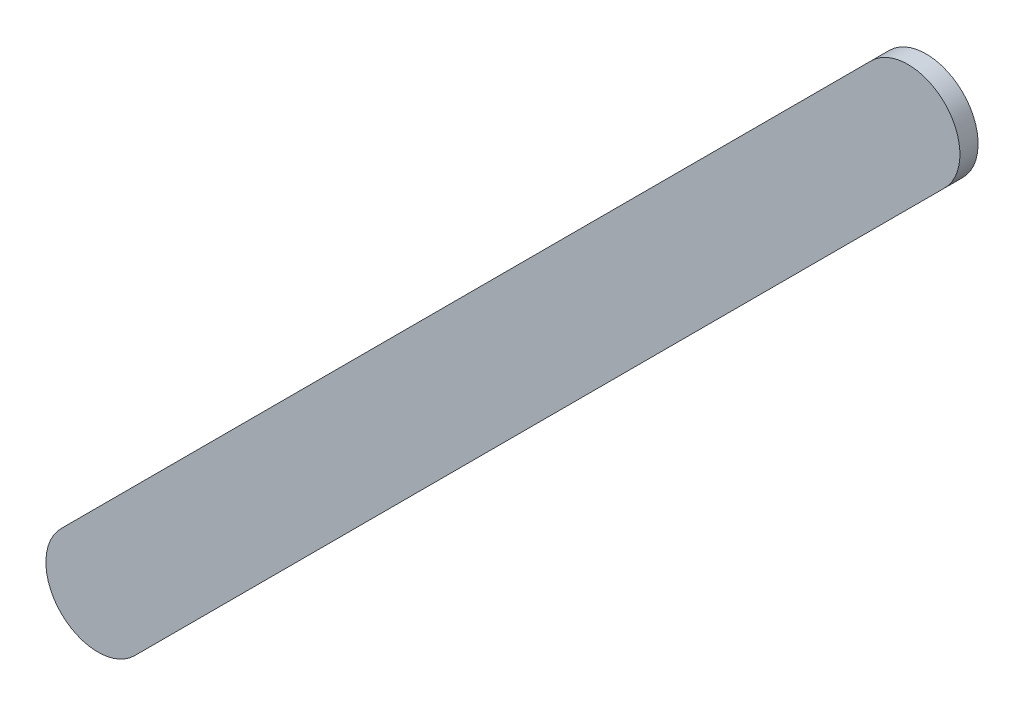
ISO-10303-21;
HEADER;
FILE_DESCRIPTION(('STEP AP214'),'2;1');
FILE_NAME('part.step','',(''),(''),'','','');
FILE_SCHEMA(('AUTOMOTIVE_DESIGN { 1 0 10303 214 1 1 1 1 }'));
ENDSEC;
DATA;
#1=APPLICATION_CONTEXT('core data for automotive mechanical design processes');
#2=APPLICATION_PROTOCOL_DEFINITION('international standard','automotive_design',2000,#1);
#3=PRODUCT_CONTEXT('',#1,'mechanical');
#4=PRODUCT('Part','Part','',(#3));
#5=PRODUCT_RELATED_PRODUCT_CATEGORY('part','',(#4));
#6=PRODUCT_DEFINITION_FORMATION('','',#4);
#7=PRODUCT_DEFINITION_CONTEXT('part definition',#1,'design');
#8=PRODUCT_DEFINITION('design','',#6,#7);
#9=PRODUCT_DEFINITION_SHAPE('','',#8);
#10=(LENGTH_UNIT() NAMED_UNIT(*) SI_UNIT(.MILLI.,.METRE.));
#11=(NAMED_UNIT(*) PLANE_ANGLE_UNIT() SI_UNIT($,.RADIAN.));
#12=(NAMED_UNIT(*) SI_UNIT($,.STERADIAN.) SOLID_ANGLE_UNIT());
#13=UNCERTAINTY_MEASURE_WITH_UNIT(LENGTH_MEASURE(1.E-05),#10,'distance_accuracy_value','');
#14=(GEOMETRIC_REPRESENTATION_CONTEXT(3) GLOBAL_UNCERTAINTY_ASSIGNED_CONTEXT((#13)) GLOBAL_UNIT_ASSIGNED_CONTEXT((#10,
#11,#12)) REPRESENTATION_CONTEXT('',''));
#15=CARTESIAN_POINT('',(0.,0.,0.));
#16=DIRECTION('',(0.,0.,1.));
#17=DIRECTION('',(1.,0.,0.));
#18=AXIS2_PLACEMENT_3D('',#15,#16,#17);
#19=CARTESIAN_POINT('',(78.089289,-130.869289,1.635));
#20=DIRECTION('',(0.,0.,1.));
#21=DIRECTION('',(1.,0.,0.));
#22=AXIS2_PLACEMENT_3D('',#19,#20,#21);
#23=PLANE('',#22);
#24=DIRECTION('',(-0.707106781186548,-0.707106781186548,0.));
#25=VECTOR('',#24,1.);
#26=CARTESIAN_POINT('',(78.089289,-130.869289,1.635));
#27=LINE('',#26,#25);
#28=CARTESIAN_POINT('',(78.089289,-130.869289,1.635));
#29=VERTEX_POINT('',#28);
#30=CARTESIAN_POINT('',(76.529289,-132.429289,1.635));
#31=VERTEX_POINT('',#30);
#32=EDGE_CURVE('E84',#29,#31,#27,.T.);
#33=ORIENTED_EDGE('',*,*,#32,.T.);
#34=CARTESIAN_POINT('',(76.5999995,-132.4999995,1.635));
#35=DIRECTION('',(0.,0.,1.));
#36=DIRECTION('',(-0.707106781186548,0.707106781186548,0.));
#37=AXIS2_PLACEMENT_3D('',#34,#35,#36);
#38=CIRCLE('',#37,0.09999974810217);
#39=CARTESIAN_POINT('',(76.67071,-132.57071,1.635));
#40=VERTEX_POINT('',#39);
#41=EDGE_CURVE('E70',#31,#40,#38,.T.);
#42=ORIENTED_EDGE('',*,*,#41,.T.);
#43=DIRECTION('',(0.707106781186548,0.707106781186548,0.));
#44=VECTOR('',#43,1.);
#45=CARTESIAN_POINT('',(76.67071,-132.57071,1.635));
#46=LINE('',#45,#44);
#47=CARTESIAN_POINT('',(78.23071,-131.01071,1.635));
#48=VERTEX_POINT('',#47);
#49=EDGE_CURVE('E114',#40,#48,#46,.T.);
#50=ORIENTED_EDGE('',*,*,#49,.T.);
#51=CARTESIAN_POINT('',(78.1599995,-130.9399995,1.635));
#52=DIRECTION('',(0.,0.,1.));
#53=DIRECTION('',(0.707106781187048,-0.707106781186048,0.));
#54=AXIS2_PLACEMENT_3D('',#51,#52,#53);
#55=CIRCLE('',#54,0.09999974810218);
#56=EDGE_CURVE('E11',#48,#29,#55,.T.);
#57=ORIENTED_EDGE('',*,*,#56,.T.);
#58=EDGE_LOOP('',(#33,#42,#50,#57));
#59=FACE_BOUND('',#58,.T.);
#60=ADVANCED_FACE('F17',(#59),#23,.T.);
#61=CARTESIAN_POINT('',(78.089289,-130.869289,1.6));
#62=DIRECTION('',(0.,0.,1.));
#63=DIRECTION('',(1.,0.,0.));
#64=AXIS2_PLACEMENT_3D('',#61,#62,#63);
#65=PLANE('',#64);
#66=CARTESIAN_POINT('',(78.1599995,-130.9399995,1.6));
#67=DIRECTION('',(0.,0.,1.));
#68=DIRECTION('',(0.707106781187048,-0.707106781186048,0.));
#69=AXIS2_PLACEMENT_3D('',#66,#67,#68);
#70=CIRCLE('',#69,0.09999974810218);
#71=CARTESIAN_POINT('',(78.23071,-131.01071,1.6));
#72=VERTEX_POINT('',#71);
#73=CARTESIAN_POINT('',(78.089289,-130.869289,1.6));
#74=VERTEX_POINT('',#73);
#75=EDGE_CURVE('E25',#72,#74,#70,.T.);
#76=ORIENTED_EDGE('',*,*,#75,.F.);
#77=DIRECTION('',(0.707106781186548,0.707106781186548,0.));
#78=VECTOR('',#77,1.);
#79=CARTESIAN_POINT('',(76.67071,-132.57071,1.6));
#80=LINE('',#79,#78);
#81=CARTESIAN_POINT('',(76.67071,-132.57071,1.6));
#82=VERTEX_POINT('',#81);
#83=EDGE_CURVE('E81',#82,#72,#80,.T.);
#84=ORIENTED_EDGE('',*,*,#83,.F.);
#85=CARTESIAN_POINT('',(76.5999995,-132.4999995,1.6));
#86=DIRECTION('',(0.,0.,1.));
#87=DIRECTION('',(-0.707106781186548,0.707106781186548,0.));
#88=AXIS2_PLACEMENT_3D('',#85,#86,#87);
#89=CIRCLE('',#88,0.09999974810217);
#90=CARTESIAN_POINT('',(76.529289,-132.429289,1.6));
#91=VERTEX_POINT('',#90);
#92=EDGE_CURVE('E102',#91,#82,#89,.T.);
#93=ORIENTED_EDGE('',*,*,#92,.F.);
#94=DIRECTION('',(-0.707106781186548,-0.707106781186548,0.));
#95=VECTOR('',#94,1.);
#96=CARTESIAN_POINT('',(78.089289,-130.869289,1.6));
#97=LINE('',#96,#95);
#98=EDGE_CURVE('E91',#74,#91,#97,.T.);
#99=ORIENTED_EDGE('',*,*,#98,.F.);
#100=EDGE_LOOP('',(#76,#84,#93,#99));
#101=FACE_BOUND('',#100,.T.);
#102=ADVANCED_FACE('F120',(#101),#65,.F.);
#103=CARTESIAN_POINT('',(78.1599995,-130.9399995,1.6));
#104=DIRECTION('',(0.,0.,-1.));
#105=DIRECTION('',(0.707106781187048,-0.707106781186048,0.));
#106=AXIS2_PLACEMENT_3D('',#103,#104,#105);
#107=CYLINDRICAL_SURFACE('',#106,0.09999974810218);
#108=ORIENTED_EDGE('',*,*,#75,.T.);
#109=DIRECTION('',(0.,0.,1.));
#110=VECTOR('',#109,1.);
#111=CARTESIAN_POINT('',(78.089289,-130.869289,1.6));
#112=LINE('',#111,#110);
#113=EDGE_CURVE('E88',#74,#29,#112,.T.);
#114=ORIENTED_EDGE('',*,*,#113,.T.);
#115=ORIENTED_EDGE('',*,*,#56,.F.);
#116=DIRECTION('',(0.,0.,1.));
#117=VECTOR('',#116,1.);
#118=CARTESIAN_POINT('',(78.23071,-131.01071,1.6));
#119=LINE('',#118,#117);
#120=EDGE_CURVE('E108',#72,#48,#119,.T.);
#121=ORIENTED_EDGE('',*,*,#120,.F.);
#122=EDGE_LOOP('',(#108,#114,#115,#121));
#123=FACE_BOUND('',#122,.T.);
#124=ADVANCED_FACE('F119',(#123),#107,.T.);
#125=CARTESIAN_POINT('',(76.67071,-132.57071,1.6));
#126=DIRECTION('',(-0.707106781186548,0.707106781186548,0.));
#127=DIRECTION('',(0.,0.,1.));
#128=AXIS2_PLACEMENT_3D('',#125,#126,#127);
#129=PLANE('',#128);
#130=ORIENTED_EDGE('',*,*,#83,.T.);
#131=ORIENTED_EDGE('',*,*,#120,.T.);
#132=ORIENTED_EDGE('',*,*,#49,.F.);
#133=DIRECTION('',(0.,0.,1.));
#134=VECTOR('',#133,1.);
#135=CARTESIAN_POINT('',(76.67071,-132.57071,1.6));
#136=LINE('',#135,#134);
#137=EDGE_CURVE('E78',#82,#40,#136,.T.);
#138=ORIENTED_EDGE('',*,*,#137,.F.);
#139=EDGE_LOOP('',(#130,#131,#132,#138));
#140=FACE_BOUND('',#139,.T.);
#141=ADVANCED_FACE('F122',(#140),#129,.F.);
#142=CARTESIAN_POINT('',(76.5999995,-132.4999995,1.6));
#143=DIRECTION('',(0.,0.,-1.));
#144=DIRECTION('',(-0.707106781186548,0.707106781186548,0.));
#145=AXIS2_PLACEMENT_3D('',#142,#143,#144);
#146=CYLINDRICAL_SURFACE('',#145,0.09999974810217);
#147=ORIENTED_EDGE('',*,*,#92,.T.);
#148=ORIENTED_EDGE('',*,*,#137,.T.);
#149=ORIENTED_EDGE('',*,*,#41,.F.);
#150=DIRECTION('',(0.,0.,1.));
#151=VECTOR('',#150,1.);
#152=CARTESIAN_POINT('',(76.529289,-132.429289,1.6));
#153=LINE('',#152,#151);
#154=EDGE_CURVE('E75',#91,#31,#153,.T.);
#155=ORIENTED_EDGE('',*,*,#154,.F.);
#156=EDGE_LOOP('',(#147,#148,#149,#155));
#157=FACE_BOUND('',#156,.T.);
#158=ADVANCED_FACE('F73',(#157),#146,.T.);
#159=CARTESIAN_POINT('',(78.089289,-130.869289,1.6));
#160=DIRECTION('',(0.707106781186548,-0.707106781186548,0.));
#161=DIRECTION('',(0.,0.,-1.));
#162=AXIS2_PLACEMENT_3D('',#159,#160,#161);
#163=PLANE('',#162);
#164=ORIENTED_EDGE('',*,*,#98,.T.);
#165=ORIENTED_EDGE('',*,*,#154,.T.);
#166=ORIENTED_EDGE('',*,*,#32,.F.);
#167=ORIENTED_EDGE('',*,*,#113,.F.);
#168=EDGE_LOOP('',(#164,#165,#166,#167));
#169=FACE_BOUND('',#168,.T.);
#170=ADVANCED_FACE('F90',(#169),#163,.F.);
#171=CLOSED_SHELL('',(#60,#102,#124,#141,#158,#170));
#172=MANIFOLD_SOLID_BREP('B1',#171);
#173=ADVANCED_BREP_SHAPE_REPRESENTATION('',(#18,#172),#14);
#174=SHAPE_DEFINITION_REPRESENTATION(#9,#173);
ENDSEC;
END-ISO-10303-21;
